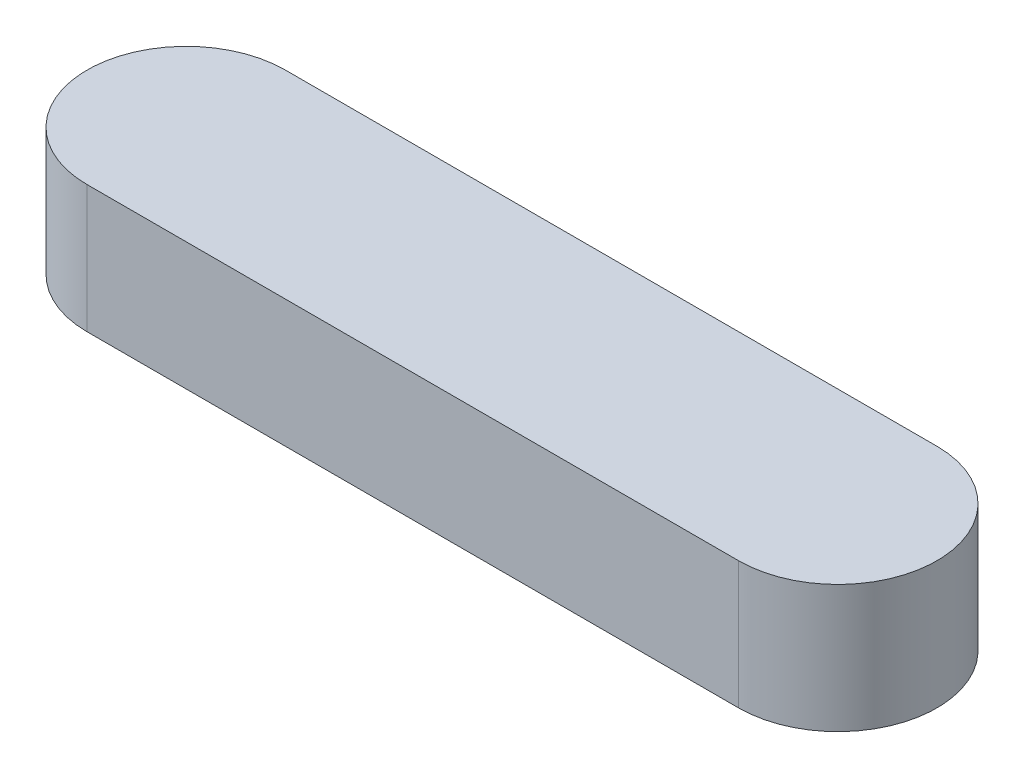
ISO-10303-21;
HEADER;
FILE_DESCRIPTION(('STEP AP214'),'2;1');
FILE_NAME('part.step','',(''),(''),'','','');
FILE_SCHEMA(('AUTOMOTIVE_DESIGN { 1 0 10303 214 1 1 1 1 }'));
ENDSEC;
DATA;
#1=APPLICATION_CONTEXT('core data for automotive mechanical design processes');
#2=APPLICATION_PROTOCOL_DEFINITION('international standard','automotive_design',2000,#1);
#3=PRODUCT_CONTEXT('',#1,'mechanical');
#4=PRODUCT('Part','Part','',(#3));
#5=PRODUCT_RELATED_PRODUCT_CATEGORY('part','',(#4));
#6=PRODUCT_DEFINITION_FORMATION('','',#4);
#7=PRODUCT_DEFINITION_CONTEXT('part definition',#1,'design');
#8=PRODUCT_DEFINITION('design','',#6,#7);
#9=PRODUCT_DEFINITION_SHAPE('','',#8);
#10=(LENGTH_UNIT() NAMED_UNIT(*) SI_UNIT(.MILLI.,.METRE.));
#11=(NAMED_UNIT(*) PLANE_ANGLE_UNIT() SI_UNIT($,.RADIAN.));
#12=(NAMED_UNIT(*) SI_UNIT($,.STERADIAN.) SOLID_ANGLE_UNIT());
#13=UNCERTAINTY_MEASURE_WITH_UNIT(LENGTH_MEASURE(1.E-05),#10,'distance_accuracy_value','');
#14=(GEOMETRIC_REPRESENTATION_CONTEXT(3) GLOBAL_UNCERTAINTY_ASSIGNED_CONTEXT((#13)) GLOBAL_UNIT_ASSIGNED_CONTEXT((#10,
#11,#12)) REPRESENTATION_CONTEXT('',''));
#15=CARTESIAN_POINT('',(0.,0.,0.));
#16=DIRECTION('',(0.,0.,1.));
#17=DIRECTION('',(1.,0.,0.));
#18=AXIS2_PLACEMENT_3D('',#15,#16,#17);
#19=CARTESIAN_POINT('',(-23.,9.,0.));
#20=DIRECTION('',(0.,-1.,0.));
#21=DIRECTION('',(0.,0.,-1.));
#22=AXIS2_PLACEMENT_3D('',#19,#20,#21);
#23=CYLINDRICAL_SURFACE('',#22,7.);
#24=CARTESIAN_POINT('',(-23.,0.,0.));
#25=DIRECTION('',(0.,1.,0.));
#26=DIRECTION('',(0.,0.,1.));
#27=AXIS2_PLACEMENT_3D('',#24,#25,#26);
#28=CIRCLE('',#27,7.);
#29=CARTESIAN_POINT('',(-23.,0.,-7.));
#30=VERTEX_POINT('',#29);
#31=CARTESIAN_POINT('',(-23.,0.,7.));
#32=VERTEX_POINT('',#31);
#33=EDGE_CURVE('E104',#30,#32,#28,.T.);
#34=ORIENTED_EDGE('',*,*,#33,.T.);
#35=DIRECTION('',(0.,-1.,0.));
#36=VECTOR('',#35,1.);
#37=CARTESIAN_POINT('',(-23.,9.,7.));
#38=LINE('',#37,#36);
#39=CARTESIAN_POINT('',(-23.,9.,7.));
#40=VERTEX_POINT('',#39);
#41=EDGE_CURVE('E11',#40,#32,#38,.T.);
#42=ORIENTED_EDGE('',*,*,#41,.F.);
#43=CARTESIAN_POINT('',(-23.,9.,0.));
#44=DIRECTION('',(0.,1.,0.));
#45=DIRECTION('',(0.,0.,1.));
#46=AXIS2_PLACEMENT_3D('',#43,#44,#45);
#47=CIRCLE('',#46,7.);
#48=CARTESIAN_POINT('',(-23.,9.,-7.));
#49=VERTEX_POINT('',#48);
#50=EDGE_CURVE('E92',#49,#40,#47,.T.);
#51=ORIENTED_EDGE('',*,*,#50,.F.);
#52=DIRECTION('',(0.,-1.,0.));
#53=VECTOR('',#52,1.);
#54=CARTESIAN_POINT('',(-23.,9.,-7.));
#55=LINE('',#54,#53);
#56=EDGE_CURVE('E100',#49,#30,#55,.T.);
#57=ORIENTED_EDGE('',*,*,#56,.T.);
#58=EDGE_LOOP('',(#34,#42,#51,#57));
#59=FACE_BOUND('',#58,.T.);
#60=ADVANCED_FACE('F41',(#59),#23,.T.);
#61=CARTESIAN_POINT('',(-23.,9.,7.));
#62=DIRECTION('',(0.,0.,-1.));
#63=DIRECTION('',(-1.,0.,0.));
#64=AXIS2_PLACEMENT_3D('',#61,#62,#63);
#65=PLANE('',#64);
#66=DIRECTION('',(1.,0.,0.));
#67=VECTOR('',#66,1.);
#68=CARTESIAN_POINT('',(-23.,0.,7.));
#69=LINE('',#68,#67);
#70=CARTESIAN_POINT('',(23.,0.,7.));
#71=VERTEX_POINT('',#70);
#72=EDGE_CURVE('E96',#32,#71,#69,.T.);
#73=ORIENTED_EDGE('',*,*,#72,.T.);
#74=DIRECTION('',(0.,-1.,0.));
#75=VECTOR('',#74,1.);
#76=CARTESIAN_POINT('',(23.,9.,7.));
#77=LINE('',#76,#75);
#78=CARTESIAN_POINT('',(23.,9.,7.));
#79=VERTEX_POINT('',#78);
#80=EDGE_CURVE('E49',#79,#71,#77,.T.);
#81=ORIENTED_EDGE('',*,*,#80,.F.);
#82=DIRECTION('',(1.,0.,0.));
#83=VECTOR('',#82,1.);
#84=CARTESIAN_POINT('',(-23.,9.,7.));
#85=LINE('',#84,#83);
#86=EDGE_CURVE('E87',#40,#79,#85,.T.);
#87=ORIENTED_EDGE('',*,*,#86,.F.);
#88=ORIENTED_EDGE('',*,*,#41,.T.);
#89=EDGE_LOOP('',(#73,#81,#87,#88));
#90=FACE_BOUND('',#89,.T.);
#91=ADVANCED_FACE('F95',(#90),#65,.F.);
#92=CARTESIAN_POINT('',(23.,9.,0.));
#93=DIRECTION('',(0.,-1.,0.));
#94=DIRECTION('',(0.,0.,-1.));
#95=AXIS2_PLACEMENT_3D('',#92,#93,#94);
#96=CYLINDRICAL_SURFACE('',#95,7.);
#97=CARTESIAN_POINT('',(23.,0.,0.));
#98=DIRECTION('',(0.,1.,0.));
#99=DIRECTION('',(0.,0.,1.));
#100=AXIS2_PLACEMENT_3D('',#97,#98,#99);
#101=CIRCLE('',#100,7.);
#102=CARTESIAN_POINT('',(23.,0.,-7.));
#103=VERTEX_POINT('',#102);
#104=EDGE_CURVE('E74',#71,#103,#101,.T.);
#105=ORIENTED_EDGE('',*,*,#104,.T.);
#106=DIRECTION('',(0.,-1.,0.));
#107=VECTOR('',#106,1.);
#108=CARTESIAN_POINT('',(23.,9.,-7.));
#109=LINE('',#108,#107);
#110=CARTESIAN_POINT('',(23.,9.,-7.));
#111=VERTEX_POINT('',#110);
#112=EDGE_CURVE('E97',#111,#103,#109,.T.);
#113=ORIENTED_EDGE('',*,*,#112,.F.);
#114=CARTESIAN_POINT('',(23.,9.,0.));
#115=DIRECTION('',(0.,1.,0.));
#116=DIRECTION('',(0.,0.,1.));
#117=AXIS2_PLACEMENT_3D('',#114,#115,#116);
#118=CIRCLE('',#117,7.);
#119=EDGE_CURVE('E90',#79,#111,#118,.T.);
#120=ORIENTED_EDGE('',*,*,#119,.F.);
#121=ORIENTED_EDGE('',*,*,#80,.T.);
#122=EDGE_LOOP('',(#105,#113,#120,#121));
#123=FACE_BOUND('',#122,.T.);
#124=ADVANCED_FACE('F98',(#123),#96,.T.);
#125=CARTESIAN_POINT('',(-23.,9.,-7.));
#126=DIRECTION('',(0.,0.,1.));
#127=DIRECTION('',(1.,0.,0.));
#128=AXIS2_PLACEMENT_3D('',#125,#126,#127);
#129=PLANE('',#128);
#130=DIRECTION('',(-1.,0.,0.));
#131=VECTOR('',#130,1.);
#132=CARTESIAN_POINT('',(-23.,0.,-7.));
#133=LINE('',#132,#131);
#134=EDGE_CURVE('E80',#103,#30,#133,.T.);
#135=ORIENTED_EDGE('',*,*,#134,.T.);
#136=ORIENTED_EDGE('',*,*,#56,.F.);
#137=DIRECTION('',(-1.,0.,0.));
#138=VECTOR('',#137,1.);
#139=CARTESIAN_POINT('',(-23.,9.,-7.));
#140=LINE('',#139,#138);
#141=EDGE_CURVE('E57',#111,#49,#140,.T.);
#142=ORIENTED_EDGE('',*,*,#141,.F.);
#143=ORIENTED_EDGE('',*,*,#112,.T.);
#144=EDGE_LOOP('',(#135,#136,#142,#143));
#145=FACE_BOUND('',#144,.T.);
#146=ADVANCED_FACE('F111',(#145),#129,.F.);
#147=CARTESIAN_POINT('',(-23.,9.,0.));
#148=DIRECTION('',(0.,1.,0.));
#149=DIRECTION('',(0.,0.,1.));
#150=AXIS2_PLACEMENT_3D('',#147,#148,#149);
#151=PLANE('',#150);
#152=ORIENTED_EDGE('',*,*,#50,.T.);
#153=ORIENTED_EDGE('',*,*,#86,.T.);
#154=ORIENTED_EDGE('',*,*,#119,.T.);
#155=ORIENTED_EDGE('',*,*,#141,.T.);
#156=EDGE_LOOP('',(#152,#153,#154,#155));
#157=FACE_BOUND('',#156,.T.);
#158=ADVANCED_FACE('F88',(#157),#151,.T.);
#159=CARTESIAN_POINT('',(-23.,0.,0.));
#160=DIRECTION('',(0.,1.,0.));
#161=DIRECTION('',(0.,0.,1.));
#162=AXIS2_PLACEMENT_3D('',#159,#160,#161);
#163=PLANE('',#162);
#164=ORIENTED_EDGE('',*,*,#33,.F.);
#165=ORIENTED_EDGE('',*,*,#134,.F.);
#166=ORIENTED_EDGE('',*,*,#104,.F.);
#167=ORIENTED_EDGE('',*,*,#72,.F.);
#168=EDGE_LOOP('',(#164,#165,#166,#167));
#169=FACE_BOUND('',#168,.T.);
#170=ADVANCED_FACE('F114',(#169),#163,.F.);
#171=CLOSED_SHELL('',(#60,#91,#124,#146,#158,#170));
#172=MANIFOLD_SOLID_BREP('B2',#171);
#173=ADVANCED_BREP_SHAPE_REPRESENTATION('',(#18,#172),#14);
#174=SHAPE_DEFINITION_REPRESENTATION(#9,#173);
ENDSEC;
END-ISO-10303-21;
